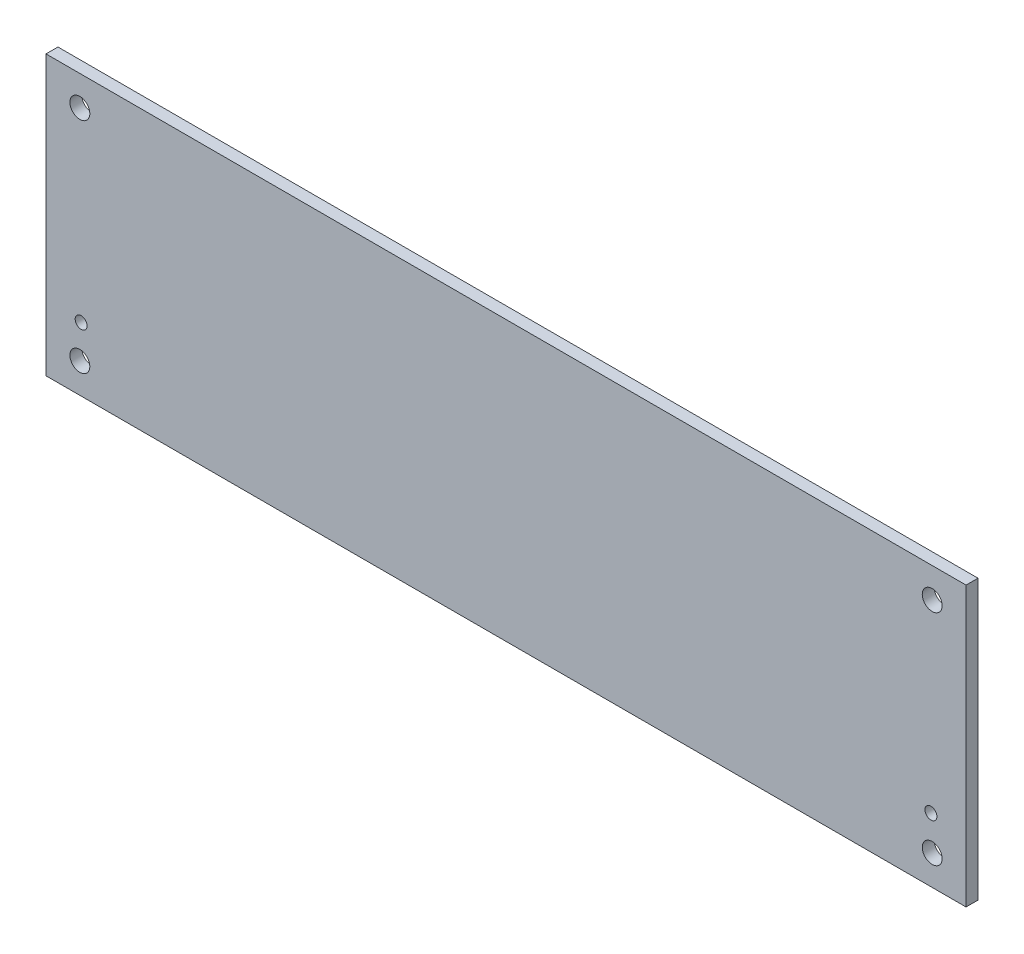
ISO-10303-21;
HEADER;
FILE_DESCRIPTION(('STEP AP214'),'2;1');
FILE_NAME('part.step','',(''),(''),'','','');
FILE_SCHEMA(('AUTOMOTIVE_DESIGN { 1 0 10303 214 1 1 1 1 }'));
ENDSEC;
DATA;
#1=APPLICATION_CONTEXT('core data for automotive mechanical design processes');
#2=APPLICATION_PROTOCOL_DEFINITION('international standard','automotive_design',2000,#1);
#3=PRODUCT_CONTEXT('',#1,'mechanical');
#4=PRODUCT('Part','Part','',(#3));
#5=PRODUCT_RELATED_PRODUCT_CATEGORY('part','',(#4));
#6=PRODUCT_DEFINITION_FORMATION('','',#4);
#7=PRODUCT_DEFINITION_CONTEXT('part definition',#1,'design');
#8=PRODUCT_DEFINITION('design','',#6,#7);
#9=PRODUCT_DEFINITION_SHAPE('','',#8);
#10=(LENGTH_UNIT() NAMED_UNIT(*) SI_UNIT(.MILLI.,.METRE.));
#11=(NAMED_UNIT(*) PLANE_ANGLE_UNIT() SI_UNIT($,.RADIAN.));
#12=(NAMED_UNIT(*) SI_UNIT($,.STERADIAN.) SOLID_ANGLE_UNIT());
#13=UNCERTAINTY_MEASURE_WITH_UNIT(LENGTH_MEASURE(1.E-05),#10,'distance_accuracy_value','');
#14=(GEOMETRIC_REPRESENTATION_CONTEXT(3) GLOBAL_UNCERTAINTY_ASSIGNED_CONTEXT((#13)) GLOBAL_UNIT_ASSIGNED_CONTEXT((#10,
#11,#12)) REPRESENTATION_CONTEXT('',''));
#15=CARTESIAN_POINT('',(0.,0.,0.));
#16=DIRECTION('',(0.,0.,1.));
#17=DIRECTION('',(1.,0.,0.));
#18=AXIS2_PLACEMENT_3D('',#15,#16,#17);
#19=CARTESIAN_POINT('',(0.,0.,3.));
#20=DIRECTION('',(0.,0.,-1.));
#21=DIRECTION('',(-1.,0.,0.));
#22=AXIS2_PLACEMENT_3D('',#19,#20,#21);
#23=PLANE('',#22);
#24=CARTESIAN_POINT('',(106.677486575876,-19.,3.));
#25=DIRECTION('',(0.,0.,-1.));
#26=DIRECTION('',(-1.,0.,0.));
#27=AXIS2_PLACEMENT_3D('',#24,#25,#26);
#28=CIRCLE('',#27,1.5);
#29=CARTESIAN_POINT('',(105.177486575876,-19.,3.));
#30=VERTEX_POINT('',#29);
#31=EDGE_CURVE('E122',#30,#30,#28,.T.);
#32=ORIENTED_EDGE('',*,*,#31,.T.);
#33=EDGE_LOOP('',(#32));
#34=FACE_BOUND('',#33,.T.);
#35=CARTESIAN_POINT('',(-106.677486575876,-19.,3.));
#36=DIRECTION('',(0.,0.,1.));
#37=DIRECTION('',(1.,0.,0.));
#38=AXIS2_PLACEMENT_3D('',#35,#36,#37);
#39=CIRCLE('',#38,1.5);
#40=CARTESIAN_POINT('',(-105.177486575876,-19.,3.));
#41=VERTEX_POINT('',#40);
#42=EDGE_CURVE('E111',#41,#41,#39,.T.);
#43=ORIENTED_EDGE('',*,*,#42,.F.);
#44=EDGE_LOOP('',(#43));
#45=FACE_BOUND('',#44,.T.);
#46=DIRECTION('',(0.,-1.,0.));
#47=VECTOR('',#46,1.);
#48=CARTESIAN_POINT('',(-115.5,35.,3.));
#49=LINE('',#48,#47);
#50=CARTESIAN_POINT('',(-115.5,35.,3.));
#51=VERTEX_POINT('',#50);
#52=CARTESIAN_POINT('',(-115.5,-35.,3.));
#53=VERTEX_POINT('',#52);
#54=EDGE_CURVE('E87',#51,#53,#49,.T.);
#55=ORIENTED_EDGE('',*,*,#54,.T.);
#56=DIRECTION('',(1.,0.,0.));
#57=VECTOR('',#56,1.);
#58=CARTESIAN_POINT('',(115.5,-35.,3.));
#59=LINE('',#58,#57);
#60=CARTESIAN_POINT('',(115.5,-35.,3.));
#61=VERTEX_POINT('',#60);
#62=EDGE_CURVE('E82',#53,#61,#59,.T.);
#63=ORIENTED_EDGE('',*,*,#62,.T.);
#64=DIRECTION('',(0.,1.,0.));
#65=VECTOR('',#64,1.);
#66=CARTESIAN_POINT('',(115.5,35.,3.));
#67=LINE('',#66,#65);
#68=CARTESIAN_POINT('',(115.5,35.,3.));
#69=VERTEX_POINT('',#68);
#70=EDGE_CURVE('E85',#61,#69,#67,.T.);
#71=ORIENTED_EDGE('',*,*,#70,.T.);
#72=DIRECTION('',(-1.,0.,0.));
#73=VECTOR('',#72,1.);
#74=CARTESIAN_POINT('',(115.5,35.,3.));
#75=LINE('',#74,#73);
#76=EDGE_CURVE('E52',#69,#51,#75,.T.);
#77=ORIENTED_EDGE('',*,*,#76,.T.);
#78=EDGE_LOOP('',(#55,#63,#71,#77));
#79=FACE_BOUND('',#78,.T.);
#80=CARTESIAN_POINT('',(-107.,27.5,3.));
#81=DIRECTION('',(0.,0.,1.));
#82=DIRECTION('',(1.,0.,0.));
#83=AXIS2_PLACEMENT_3D('',#80,#81,#82);
#84=CIRCLE('',#83,2.50000000000001);
#85=CARTESIAN_POINT('',(-104.5,27.5,3.));
#86=VERTEX_POINT('',#85);
#87=EDGE_CURVE('E103',#86,#86,#84,.T.);
#88=ORIENTED_EDGE('',*,*,#87,.F.);
#89=EDGE_LOOP('',(#88));
#90=FACE_BOUND('',#89,.T.);
#91=CARTESIAN_POINT('',(-107.,-27.5,3.));
#92=DIRECTION('',(0.,0.,1.));
#93=DIRECTION('',(-1.,0.,0.));
#94=AXIS2_PLACEMENT_3D('',#91,#92,#93);
#95=CIRCLE('',#94,2.50000000000001);
#96=CARTESIAN_POINT('',(-109.5,-27.5,3.));
#97=VERTEX_POINT('',#96);
#98=EDGE_CURVE('E134',#97,#97,#95,.T.);
#99=ORIENTED_EDGE('',*,*,#98,.F.);
#100=EDGE_LOOP('',(#99));
#101=FACE_BOUND('',#100,.T.);
#102=CARTESIAN_POINT('',(107.,-27.4999999999999,3.));
#103=DIRECTION('',(0.,0.,1.));
#104=DIRECTION('',(1.,0.,0.));
#105=AXIS2_PLACEMENT_3D('',#102,#103,#104);
#106=CIRCLE('',#105,2.50000000000001);
#107=CARTESIAN_POINT('',(109.5,-27.4999999999999,3.));
#108=VERTEX_POINT('',#107);
#109=EDGE_CURVE('E128',#108,#108,#106,.T.);
#110=ORIENTED_EDGE('',*,*,#109,.F.);
#111=EDGE_LOOP('',(#110));
#112=FACE_BOUND('',#111,.T.);
#113=CARTESIAN_POINT('',(107.,27.5,3.));
#114=DIRECTION('',(0.,0.,1.));
#115=DIRECTION('',(-1.,0.,0.));
#116=AXIS2_PLACEMENT_3D('',#113,#114,#115);
#117=CIRCLE('',#116,2.50000000000001);
#118=CARTESIAN_POINT('',(104.5,27.5,3.));
#119=VERTEX_POINT('',#118);
#120=EDGE_CURVE('E115',#119,#119,#117,.T.);
#121=ORIENTED_EDGE('',*,*,#120,.F.);
#122=EDGE_LOOP('',(#121));
#123=FACE_BOUND('',#122,.T.);
#124=ADVANCED_FACE('F33',(#34,#45,#79,#90,#101,#112,#123),#23,.F.);
#125=CARTESIAN_POINT('',(0.,0.,0.));
#126=DIRECTION('',(0.,0.,-1.));
#127=DIRECTION('',(-1.,0.,0.));
#128=AXIS2_PLACEMENT_3D('',#125,#126,#127);
#129=PLANE('',#128);
#130=CARTESIAN_POINT('',(106.677486575876,-19.,0.));
#131=DIRECTION('',(0.,0.,-1.));
#132=DIRECTION('',(-1.,0.,0.));
#133=AXIS2_PLACEMENT_3D('',#130,#131,#132);
#134=CIRCLE('',#133,1.5);
#135=CARTESIAN_POINT('',(105.177486575876,-19.,0.));
#136=VERTEX_POINT('',#135);
#137=EDGE_CURVE('E37',#136,#136,#134,.F.);
#138=ORIENTED_EDGE('',*,*,#137,.T.);
#139=EDGE_LOOP('',(#138));
#140=FACE_BOUND('',#139,.T.);
#141=CARTESIAN_POINT('',(-106.677486575876,-19.,0.));
#142=DIRECTION('',(0.,0.,-1.));
#143=DIRECTION('',(-1.,0.,0.));
#144=AXIS2_PLACEMENT_3D('',#141,#142,#143);
#145=CIRCLE('',#144,1.5);
#146=CARTESIAN_POINT('',(-108.177486575876,-19.,0.));
#147=VERTEX_POINT('',#146);
#148=EDGE_CURVE('E108',#147,#147,#145,.T.);
#149=ORIENTED_EDGE('',*,*,#148,.F.);
#150=EDGE_LOOP('',(#149));
#151=FACE_BOUND('',#150,.T.);
#152=CARTESIAN_POINT('',(107.,-27.4999999999999,0.));
#153=DIRECTION('',(0.,0.,1.));
#154=DIRECTION('',(1.,0.,0.));
#155=AXIS2_PLACEMENT_3D('',#152,#153,#154);
#156=CIRCLE('',#155,2.50000000000001);
#157=CARTESIAN_POINT('',(109.5,-27.4999999999999,0.));
#158=VERTEX_POINT('',#157);
#159=EDGE_CURVE('E126',#158,#158,#156,.T.);
#160=ORIENTED_EDGE('',*,*,#159,.T.);
#161=EDGE_LOOP('',(#160));
#162=FACE_BOUND('',#161,.T.);
#163=CARTESIAN_POINT('',(-107.,27.5,0.));
#164=DIRECTION('',(0.,0.,1.));
#165=DIRECTION('',(1.,0.,0.));
#166=AXIS2_PLACEMENT_3D('',#163,#164,#165);
#167=CIRCLE('',#166,2.50000000000001);
#168=CARTESIAN_POINT('',(-104.5,27.5,0.));
#169=VERTEX_POINT('',#168);
#170=EDGE_CURVE('E137',#169,#169,#167,.T.);
#171=ORIENTED_EDGE('',*,*,#170,.T.);
#172=EDGE_LOOP('',(#171));
#173=FACE_BOUND('',#172,.T.);
#174=DIRECTION('',(0.,-1.,0.));
#175=VECTOR('',#174,1.);
#176=CARTESIAN_POINT('',(-115.5,35.,0.));
#177=LINE('',#176,#175);
#178=CARTESIAN_POINT('',(-115.5,35.,0.));
#179=VERTEX_POINT('',#178);
#180=CARTESIAN_POINT('',(-115.5,-35.,0.));
#181=VERTEX_POINT('',#180);
#182=EDGE_CURVE('E100',#179,#181,#177,.T.);
#183=ORIENTED_EDGE('',*,*,#182,.F.);
#184=DIRECTION('',(-1.,0.,0.));
#185=VECTOR('',#184,1.);
#186=CARTESIAN_POINT('',(115.5,35.,0.));
#187=LINE('',#186,#185);
#188=CARTESIAN_POINT('',(115.5,35.,0.));
#189=VERTEX_POINT('',#188);
#190=EDGE_CURVE('E75',#189,#179,#187,.T.);
#191=ORIENTED_EDGE('',*,*,#190,.F.);
#192=DIRECTION('',(0.,1.,0.));
#193=VECTOR('',#192,1.);
#194=CARTESIAN_POINT('',(115.5,35.,0.));
#195=LINE('',#194,#193);
#196=CARTESIAN_POINT('',(115.5,-35.,0.));
#197=VERTEX_POINT('',#196);
#198=EDGE_CURVE('E69',#197,#189,#195,.T.);
#199=ORIENTED_EDGE('',*,*,#198,.F.);
#200=DIRECTION('',(1.,0.,0.));
#201=VECTOR('',#200,1.);
#202=CARTESIAN_POINT('',(115.5,-35.,0.));
#203=LINE('',#202,#201);
#204=EDGE_CURVE('E91',#181,#197,#203,.T.);
#205=ORIENTED_EDGE('',*,*,#204,.F.);
#206=EDGE_LOOP('',(#183,#191,#199,#205));
#207=FACE_BOUND('',#206,.T.);
#208=CARTESIAN_POINT('',(-107.,-27.5,0.));
#209=DIRECTION('',(0.,0.,1.));
#210=DIRECTION('',(-1.,0.,0.));
#211=AXIS2_PLACEMENT_3D('',#208,#209,#210);
#212=CIRCLE('',#211,2.50000000000001);
#213=CARTESIAN_POINT('',(-109.5,-27.5,0.));
#214=VERTEX_POINT('',#213);
#215=EDGE_CURVE('E131',#214,#214,#212,.T.);
#216=ORIENTED_EDGE('',*,*,#215,.T.);
#217=EDGE_LOOP('',(#216));
#218=FACE_BOUND('',#217,.T.);
#219=CARTESIAN_POINT('',(107.,27.5,0.));
#220=DIRECTION('',(0.,0.,1.));
#221=DIRECTION('',(-1.,0.,0.));
#222=AXIS2_PLACEMENT_3D('',#219,#220,#221);
#223=CIRCLE('',#222,2.50000000000001);
#224=CARTESIAN_POINT('',(104.5,27.5,0.));
#225=VERTEX_POINT('',#224);
#226=EDGE_CURVE('E110',#225,#225,#223,.T.);
#227=ORIENTED_EDGE('',*,*,#226,.T.);
#228=EDGE_LOOP('',(#227));
#229=FACE_BOUND('',#228,.T.);
#230=ADVANCED_FACE('F145',(#140,#151,#162,#173,#207,#218,#229),#129,.T.);
#231=CARTESIAN_POINT('',(-115.5,35.,3.));
#232=DIRECTION('',(1.,0.,0.));
#233=DIRECTION('',(0.,0.,-1.));
#234=AXIS2_PLACEMENT_3D('',#231,#232,#233);
#235=PLANE('',#234);
#236=ORIENTED_EDGE('',*,*,#182,.T.);
#237=DIRECTION('',(0.,0.,-1.));
#238=VECTOR('',#237,1.);
#239=CARTESIAN_POINT('',(-115.5,-35.,3.));
#240=LINE('',#239,#238);
#241=EDGE_CURVE('E11',#53,#181,#240,.T.);
#242=ORIENTED_EDGE('',*,*,#241,.F.);
#243=ORIENTED_EDGE('',*,*,#54,.F.);
#244=DIRECTION('',(0.,0.,-1.));
#245=VECTOR('',#244,1.);
#246=CARTESIAN_POINT('',(-115.5,35.,3.));
#247=LINE('',#246,#245);
#248=EDGE_CURVE('E96',#51,#179,#247,.T.);
#249=ORIENTED_EDGE('',*,*,#248,.T.);
#250=EDGE_LOOP('',(#236,#242,#243,#249));
#251=FACE_BOUND('',#250,.T.);
#252=ADVANCED_FACE('F35',(#251),#235,.F.);
#253=CARTESIAN_POINT('',(115.5,-35.,3.));
#254=DIRECTION('',(0.,1.,0.));
#255=DIRECTION('',(0.,0.,1.));
#256=AXIS2_PLACEMENT_3D('',#253,#254,#255);
#257=PLANE('',#256);
#258=ORIENTED_EDGE('',*,*,#204,.T.);
#259=DIRECTION('',(0.,0.,-1.));
#260=VECTOR('',#259,1.);
#261=CARTESIAN_POINT('',(115.5,-35.,3.));
#262=LINE('',#261,#260);
#263=EDGE_CURVE('E43',#61,#197,#262,.T.);
#264=ORIENTED_EDGE('',*,*,#263,.F.);
#265=ORIENTED_EDGE('',*,*,#62,.F.);
#266=ORIENTED_EDGE('',*,*,#241,.T.);
#267=EDGE_LOOP('',(#258,#264,#265,#266));
#268=FACE_BOUND('',#267,.T.);
#269=ADVANCED_FACE('F90',(#268),#257,.F.);
#270=CARTESIAN_POINT('',(115.5,35.,3.));
#271=DIRECTION('',(-1.,0.,0.));
#272=DIRECTION('',(0.,0.,1.));
#273=AXIS2_PLACEMENT_3D('',#270,#271,#272);
#274=PLANE('',#273);
#275=ORIENTED_EDGE('',*,*,#198,.T.);
#276=DIRECTION('',(0.,0.,-1.));
#277=VECTOR('',#276,1.);
#278=CARTESIAN_POINT('',(115.5,35.,3.));
#279=LINE('',#278,#277);
#280=EDGE_CURVE('E92',#69,#189,#279,.T.);
#281=ORIENTED_EDGE('',*,*,#280,.F.);
#282=ORIENTED_EDGE('',*,*,#70,.F.);
#283=ORIENTED_EDGE('',*,*,#263,.T.);
#284=EDGE_LOOP('',(#275,#281,#282,#283));
#285=FACE_BOUND('',#284,.T.);
#286=ADVANCED_FACE('F94',(#285),#274,.F.);
#287=CARTESIAN_POINT('',(115.5,35.,3.));
#288=DIRECTION('',(0.,-1.,0.));
#289=DIRECTION('',(0.,0.,-1.));
#290=AXIS2_PLACEMENT_3D('',#287,#288,#289);
#291=PLANE('',#290);
#292=ORIENTED_EDGE('',*,*,#190,.T.);
#293=ORIENTED_EDGE('',*,*,#248,.F.);
#294=ORIENTED_EDGE('',*,*,#76,.F.);
#295=ORIENTED_EDGE('',*,*,#280,.T.);
#296=EDGE_LOOP('',(#292,#293,#294,#295));
#297=FACE_BOUND('',#296,.T.);
#298=ADVANCED_FACE('F151',(#297),#291,.F.);
#299=CARTESIAN_POINT('',(-107.,27.5,3.));
#300=DIRECTION('',(0.,0.,-1.));
#301=DIRECTION('',(-1.,0.,0.));
#302=AXIS2_PLACEMENT_3D('',#299,#300,#301);
#303=CYLINDRICAL_SURFACE('',#302,2.50000000000001);
#304=ORIENTED_EDGE('',*,*,#87,.T.);
#305=EDGE_LOOP('',(#304));
#306=FACE_BOUND('',#305,.T.);
#307=ORIENTED_EDGE('',*,*,#170,.F.);
#308=EDGE_LOOP('',(#307));
#309=FACE_BOUND('',#308,.T.);
#310=ADVANCED_FACE('F148',(#306,#309),#303,.F.);
#311=CARTESIAN_POINT('',(-107.,-27.5,3.));
#312=DIRECTION('',(0.,0.,-1.));
#313=DIRECTION('',(-1.,0.,0.));
#314=AXIS2_PLACEMENT_3D('',#311,#312,#313);
#315=CYLINDRICAL_SURFACE('',#314,2.50000000000001);
#316=ORIENTED_EDGE('',*,*,#98,.T.);
#317=EDGE_LOOP('',(#316));
#318=FACE_BOUND('',#317,.T.);
#319=ORIENTED_EDGE('',*,*,#215,.F.);
#320=EDGE_LOOP('',(#319));
#321=FACE_BOUND('',#320,.T.);
#322=ADVANCED_FACE('F150',(#318,#321),#315,.F.);
#323=CARTESIAN_POINT('',(107.,-27.4999999999999,3.));
#324=DIRECTION('',(0.,0.,-1.));
#325=DIRECTION('',(-1.,0.,0.));
#326=AXIS2_PLACEMENT_3D('',#323,#324,#325);
#327=CYLINDRICAL_SURFACE('',#326,2.50000000000001);
#328=ORIENTED_EDGE('',*,*,#109,.T.);
#329=EDGE_LOOP('',(#328));
#330=FACE_BOUND('',#329,.T.);
#331=ORIENTED_EDGE('',*,*,#159,.F.);
#332=EDGE_LOOP('',(#331));
#333=FACE_BOUND('',#332,.T.);
#334=ADVANCED_FACE('F158',(#330,#333),#327,.F.);
#335=CARTESIAN_POINT('',(107.,27.5,3.));
#336=DIRECTION('',(0.,0.,-1.));
#337=DIRECTION('',(-1.,0.,0.));
#338=AXIS2_PLACEMENT_3D('',#335,#336,#337);
#339=CYLINDRICAL_SURFACE('',#338,2.50000000000001);
#340=ORIENTED_EDGE('',*,*,#120,.T.);
#341=EDGE_LOOP('',(#340));
#342=FACE_BOUND('',#341,.T.);
#343=ORIENTED_EDGE('',*,*,#226,.F.);
#344=EDGE_LOOP('',(#343));
#345=FACE_BOUND('',#344,.T.);
#346=ADVANCED_FACE('F187',(#342,#345),#339,.F.);
#347=CARTESIAN_POINT('',(-106.677486575876,-19.,-7.));
#348=DIRECTION('',(0.,0.,1.));
#349=DIRECTION('',(1.,0.,0.));
#350=AXIS2_PLACEMENT_3D('',#347,#348,#349);
#351=CYLINDRICAL_SURFACE('',#350,1.5);
#352=ORIENTED_EDGE('',*,*,#148,.T.);
#353=EDGE_LOOP('',(#352));
#354=FACE_BOUND('',#353,.T.);
#355=ORIENTED_EDGE('',*,*,#42,.T.);
#356=EDGE_LOOP('',(#355));
#357=FACE_BOUND('',#356,.T.);
#358=ADVANCED_FACE('F189',(#354,#357),#351,.F.);
#359=CARTESIAN_POINT('',(106.677486575876,-19.,-7.));
#360=DIRECTION('',(0.,0.,1.));
#361=DIRECTION('',(1.,0.,0.));
#362=AXIS2_PLACEMENT_3D('',#359,#360,#361);
#363=CYLINDRICAL_SURFACE('',#362,1.5);
#364=ORIENTED_EDGE('',*,*,#137,.F.);
#365=EDGE_LOOP('',(#364));
#366=FACE_BOUND('',#365,.T.);
#367=ORIENTED_EDGE('',*,*,#31,.F.);
#368=EDGE_LOOP('',(#367));
#369=FACE_BOUND('',#368,.T.);
#370=ADVANCED_FACE('F196',(#366,#369),#363,.F.);
#371=CLOSED_SHELL('',(#124,#230,#252,#269,#286,#298,#310,#322,#334,#346,#358,#370));
#372=MANIFOLD_SOLID_BREP('B2',#371);
#373=ADVANCED_BREP_SHAPE_REPRESENTATION('',(#18,#372),#14);
#374=SHAPE_DEFINITION_REPRESENTATION(#9,#373);
ENDSEC;
END-ISO-10303-21;
